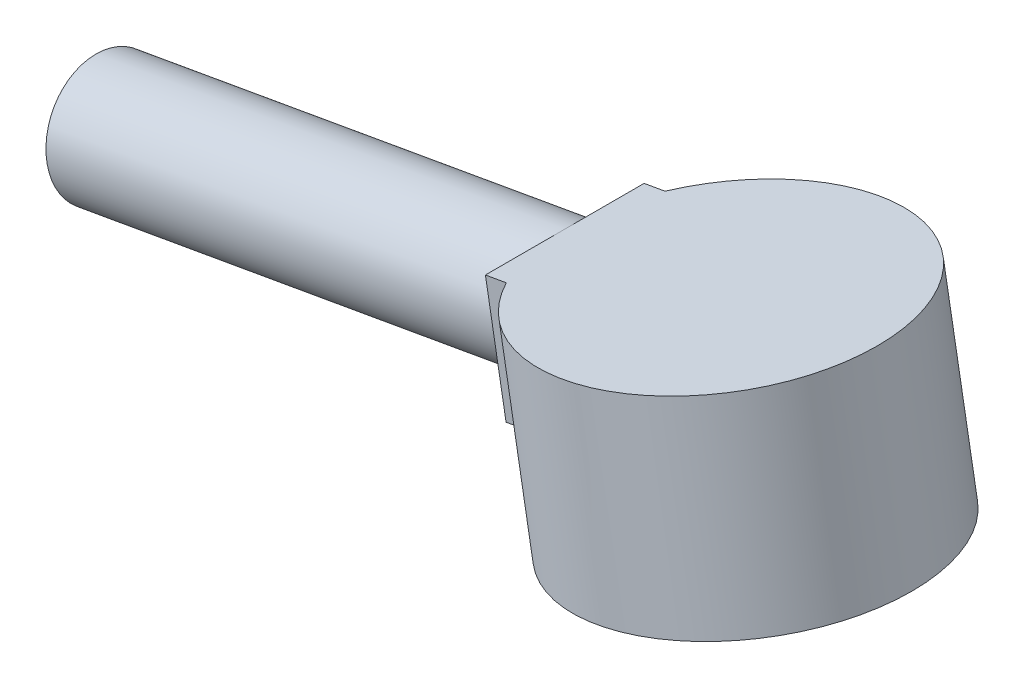
ISO-10303-21;
HEADER;
FILE_DESCRIPTION(('STEP AP214'),'2;1');
FILE_NAME('part.step','',(''),(''),'','','');
FILE_SCHEMA(('AUTOMOTIVE_DESIGN { 1 0 10303 214 1 1 1 1 }'));
ENDSEC;
DATA;
#1=APPLICATION_CONTEXT('core data for automotive mechanical design processes');
#2=APPLICATION_PROTOCOL_DEFINITION('international standard','automotive_design',2000,#1);
#3=PRODUCT_CONTEXT('',#1,'mechanical');
#4=PRODUCT('Part','Part','',(#3));
#5=PRODUCT_RELATED_PRODUCT_CATEGORY('part','',(#4));
#6=PRODUCT_DEFINITION_FORMATION('','',#4);
#7=PRODUCT_DEFINITION_CONTEXT('part definition',#1,'design');
#8=PRODUCT_DEFINITION('design','',#6,#7);
#9=PRODUCT_DEFINITION_SHAPE('','',#8);
#10=(LENGTH_UNIT() NAMED_UNIT(*) SI_UNIT(.MILLI.,.METRE.));
#11=(NAMED_UNIT(*) PLANE_ANGLE_UNIT() SI_UNIT($,.RADIAN.));
#12=(NAMED_UNIT(*) SI_UNIT($,.STERADIAN.) SOLID_ANGLE_UNIT());
#13=UNCERTAINTY_MEASURE_WITH_UNIT(LENGTH_MEASURE(1.E-05),#10,'distance_accuracy_value','');
#14=(GEOMETRIC_REPRESENTATION_CONTEXT(3) GLOBAL_UNCERTAINTY_ASSIGNED_CONTEXT((#13)) GLOBAL_UNIT_ASSIGNED_CONTEXT((#10,
#11,#12)) REPRESENTATION_CONTEXT('',''));
#15=CARTESIAN_POINT('',(0.,0.,0.));
#16=DIRECTION('',(0.,0.,1.));
#17=DIRECTION('',(1.,0.,0.));
#18=AXIS2_PLACEMENT_3D('',#15,#16,#17);
#19=CARTESIAN_POINT('',(576.813184603333,235.180258454421,1500.2586616298));
#20=DIRECTION('',(-0.173648177666917,0.98480775301221,0.));
#21=DIRECTION('',(0.984807753012211,0.173648177666917,0.));
#22=AXIS2_PLACEMENT_3D('',#19,#20,#21);
#23=PLANE('',#22);
#24=DIRECTION('',(-0.98480775301221,-0.173648177666917,0.));
#25=VECTOR('',#24,1.);
#26=CARTESIAN_POINT('',(576.813184603333,235.180258454421,1520.2586616298));
#27=LINE('',#26,#25);
#28=CARTESIAN_POINT('',(554.831775199223,231.304342902478,1520.2586616298));
#29=VERTEX_POINT('',#28);
#30=CARTESIAN_POINT('',(552.192990778028,230.839054012748,1520.2586616298));
#31=VERTEX_POINT('',#30);
#32=EDGE_CURVE('E119',#29,#31,#27,.T.);
#33=ORIENTED_EDGE('',*,*,#32,.T.);
#34=DIRECTION('',(0.,0.,1.));
#35=VECTOR('',#34,1.);
#36=CARTESIAN_POINT('',(552.192990778028,230.839054012748,1500.2586616298));
#37=LINE('',#36,#35);
#38=CARTESIAN_POINT('',(552.192990778028,230.839054012748,1510.2586616298));
#39=VERTEX_POINT('',#38);
#40=EDGE_CURVE('E108',#39,#31,#37,.T.);
#41=ORIENTED_EDGE('',*,*,#40,.F.);
#42=CARTESIAN_POINT('',(571.889145838272,234.312017566086,1510.2586616298));
#43=DIRECTION('',(0.173648177666917,-0.98480775301221,0.));
#44=DIRECTION('',(0.984807753012211,0.173648177666917,0.));
#45=AXIS2_PLACEMENT_3D('',#42,#43,#44);
#46=CIRCLE('',#45,20.0000000000001);
#47=EDGE_CURVE('E130',#29,#39,#46,.T.);
#48=ORIENTED_EDGE('',*,*,#47,.F.);
#49=EDGE_LOOP('',(#33,#41,#48));
#50=FACE_BOUND('',#49,.T.);
#51=ADVANCED_FACE('F39',(#50),#23,.F.);
#52=CARTESIAN_POINT('',(550.890629445526,238.225112160339,1510.2586616298));
#53=DIRECTION('',(-0.98480775301221,-0.173648177666917,0.));
#54=DIRECTION('',(-0.173648177666917,0.98480775301221,0.));
#55=AXIS2_PLACEMENT_3D('',#52,#53,#54);
#56=CYLINDRICAL_SURFACE('',#55,7.49999999999997);
#57=CARTESIAN_POINT('',(550.890629445526,238.225112160339,1510.2586616298));
#58=DIRECTION('',(0.984807753012211,0.173648177666917,0.));
#59=DIRECTION('',(-0.173648177666917,0.98480775301221,0.));
#60=AXIS2_PLACEMENT_3D('',#57,#58,#59);
#61=CIRCLE('',#60,7.49999999999997);
#62=CARTESIAN_POINT('',(549.588268113024,245.611170307931,1510.2586616298));
#63=VERTEX_POINT('',#62);
#64=EDGE_CURVE('E124',#63,#39,#61,.T.);
#65=ORIENTED_EDGE('',*,*,#64,.F.);
#66=EDGE_CURVE('E127',#39,#63,#61,.T.);
#67=ORIENTED_EDGE('',*,*,#66,.F.);
#68=EDGE_LOOP('',(#65,#67));
#69=FACE_BOUND('',#68,.T.);
#70=CARTESIAN_POINT('',(491.802164264793,227.806221500324,1510.2586616298));
#71=DIRECTION('',(0.984807753012211,0.173648177666917,0.));
#72=DIRECTION('',(-0.173648177666917,0.98480775301221,0.));
#73=AXIS2_PLACEMENT_3D('',#70,#71,#72);
#74=CIRCLE('',#73,7.49999999999997);
#75=CARTESIAN_POINT('',(490.499802932292,235.192279647916,1510.2586616298));
#76=VERTEX_POINT('',#75);
#77=EDGE_CURVE('E93',#76,#76,#74,.T.);
#78=ORIENTED_EDGE('',*,*,#77,.T.);
#79=EDGE_LOOP('',(#78));
#80=FACE_BOUND('',#79,.T.);
#81=ADVANCED_FACE('F139',(#69,#80),#56,.T.);
#82=CARTESIAN_POINT('',(491.802164264793,227.806221500324,1510.2586616298));
#83=DIRECTION('',(-0.984807753012211,-0.173648177666917,0.));
#84=DIRECTION('',(-0.173648177666917,0.98480775301221,0.));
#85=AXIS2_PLACEMENT_3D('',#82,#83,#84);
#86=PLANE('',#85);
#87=ORIENTED_EDGE('',*,*,#77,.F.);
#88=EDGE_LOOP('',(#87));
#89=FACE_BOUND('',#88,.T.);
#90=ADVANCED_FACE('F146',(#89),#86,.T.);
#91=CARTESIAN_POINT('',(575.018137900222,101.391212108543,0.));
#92=DIRECTION('',(-0.98480775301221,-0.173648177666919,0.));
#93=DIRECTION('',(-0.173648177666919,0.98480775301221,0.));
#94=AXIS2_PLACEMENT_3D('',#91,#92,#93);
#95=PLANE('',#94);
#96=ORIENTED_EDGE('',*,*,#64,.T.);
#97=ORIENTED_EDGE('',*,*,#40,.T.);
#98=DIRECTION('',(-0.173648177666919,0.98480775301221,0.));
#99=VECTOR('',#98,1.);
#100=CARTESIAN_POINT('',(552.192990778028,230.839054012748,1520.2586616298));
#101=LINE('',#100,#99);
#102=CARTESIAN_POINT('',(549.588268113024,245.611170307931,1520.2586616298));
#103=VERTEX_POINT('',#102);
#104=EDGE_CURVE('E89',#31,#103,#101,.T.);
#105=ORIENTED_EDGE('',*,*,#104,.T.);
#106=DIRECTION('',(0.,0.,-1.));
#107=VECTOR('',#106,1.);
#108=CARTESIAN_POINT('',(549.588268113024,245.611170307931,1500.2586616298));
#109=LINE('',#108,#107);
#110=EDGE_CURVE('E97',#103,#63,#109,.T.);
#111=ORIENTED_EDGE('',*,*,#110,.T.);
#112=EDGE_LOOP('',(#96,#97,#105,#111));
#113=FACE_BOUND('',#112,.T.);
#114=ADVANCED_FACE('F106',(#113),#95,.T.);
#115=ORIENTED_EDGE('',*,*,#66,.T.);
#116=CARTESIAN_POINT('',(549.588268113024,245.611170307931,1500.2586616298));
#117=VERTEX_POINT('',#116);
#118=EDGE_CURVE('E100',#63,#117,#109,.T.);
#119=ORIENTED_EDGE('',*,*,#118,.T.);
#120=DIRECTION('',(0.173648177666919,-0.98480775301221,0.));
#121=VECTOR('',#120,1.);
#122=CARTESIAN_POINT('',(552.192990778028,230.839054012748,1500.2586616298));
#123=LINE('',#122,#121);
#124=CARTESIAN_POINT('',(552.192990778028,230.839054012748,1500.2586616298));
#125=VERTEX_POINT('',#124);
#126=EDGE_CURVE('E104',#117,#125,#123,.T.);
#127=ORIENTED_EDGE('',*,*,#126,.T.);
#128=EDGE_CURVE('E116',#125,#39,#37,.T.);
#129=ORIENTED_EDGE('',*,*,#128,.T.);
#130=EDGE_LOOP('',(#115,#119,#127,#129));
#131=FACE_BOUND('',#130,.T.);
#132=ADVANCED_FACE('F167',(#131),#95,.T.);
#133=CARTESIAN_POINT('',(576.813184603333,235.180258454421,1520.2586616298));
#134=DIRECTION('',(0.,0.,-1.));
#135=DIRECTION('',(1.,0.,0.));
#136=AXIS2_PLACEMENT_3D('',#133,#134,#135);
#137=PLANE('',#136);
#138=DIRECTION('',(-0.98480775301221,-0.173648177666917,0.));
#139=VECTOR('',#138,1.);
#140=CARTESIAN_POINT('',(574.208461938329,249.952374749604,1520.2586616298));
#141=LINE('',#140,#139);
#142=CARTESIAN_POINT('',(552.22705253422,246.076459197661,1520.2586616298));
#143=VERTEX_POINT('',#142);
#144=EDGE_CURVE('E84',#143,#103,#141,.T.);
#145=ORIENTED_EDGE('',*,*,#144,.T.);
#146=ORIENTED_EDGE('',*,*,#104,.F.);
#147=ORIENTED_EDGE('',*,*,#32,.F.);
#148=DIRECTION('',(-0.173648177666917,0.98480775301221,0.));
#149=VECTOR('',#148,1.);
#150=CARTESIAN_POINT('',(556.568256975893,221.456265372356,1520.2586616298));
#151=LINE('',#150,#149);
#152=EDGE_CURVE('E91',#143,#29,#151,.F.);
#153=ORIENTED_EDGE('',*,*,#152,.F.);
#154=EDGE_LOOP('',(#145,#146,#147,#153));
#155=FACE_BOUND('',#154,.T.);
#156=ADVANCED_FACE('F86',(#155),#137,.F.);
#157=CARTESIAN_POINT('',(574.208461938329,249.952374749604,1500.2586616298));
#158=DIRECTION('',(0.173648177666917,-0.98480775301221,0.));
#159=DIRECTION('',(-0.984807753012211,-0.173648177666917,0.));
#160=AXIS2_PLACEMENT_3D('',#157,#158,#159);
#161=PLANE('',#160);
#162=CARTESIAN_POINT('',(569.284423173269,249.084133861269,1510.2586616298));
#163=DIRECTION('',(0.173648177666917,-0.984807753012211,0.));
#164=DIRECTION('',(0.98480775301221,0.173648177666917,0.));
#165=AXIS2_PLACEMENT_3D('',#162,#163,#164);
#166=CIRCLE('',#165,20.0000000000001);
#167=CARTESIAN_POINT('',(552.22705253422,246.076459197661,1500.2586616298));
#168=VERTEX_POINT('',#167);
#169=EDGE_CURVE('E54',#168,#143,#166,.T.);
#170=ORIENTED_EDGE('',*,*,#169,.F.);
#171=DIRECTION('',(-0.98480775301221,-0.173648177666917,0.));
#172=VECTOR('',#171,1.);
#173=CARTESIAN_POINT('',(574.208461938329,249.952374749604,1500.2586616298));
#174=LINE('',#173,#172);
#175=EDGE_CURVE('E94',#168,#117,#174,.T.);
#176=ORIENTED_EDGE('',*,*,#175,.T.);
#177=ORIENTED_EDGE('',*,*,#118,.F.);
#178=ORIENTED_EDGE('',*,*,#110,.F.);
#179=ORIENTED_EDGE('',*,*,#144,.F.);
#180=EDGE_LOOP('',(#170,#176,#177,#178,#179));
#181=FACE_BOUND('',#180,.T.);
#182=ADVANCED_FACE('F98',(#181),#161,.F.);
#183=CARTESIAN_POINT('',(576.813184603333,235.180258454421,1500.2586616298));
#184=DIRECTION('',(0.,0.,1.));
#185=DIRECTION('',(-1.,0.,0.));
#186=AXIS2_PLACEMENT_3D('',#183,#184,#185);
#187=PLANE('',#186);
#188=DIRECTION('',(-0.98480775301221,-0.173648177666917,0.));
#189=VECTOR('',#188,1.);
#190=CARTESIAN_POINT('',(576.813184603333,235.180258454421,1500.2586616298));
#191=LINE('',#190,#189);
#192=CARTESIAN_POINT('',(554.831775199223,231.304342902478,1500.2586616298));
#193=VERTEX_POINT('',#192);
#194=EDGE_CURVE('E121',#193,#125,#191,.T.);
#195=ORIENTED_EDGE('',*,*,#194,.T.);
#196=ORIENTED_EDGE('',*,*,#126,.F.);
#197=ORIENTED_EDGE('',*,*,#175,.F.);
#198=DIRECTION('',(-0.173648177666917,0.98480775301221,0.));
#199=VECTOR('',#198,1.);
#200=CARTESIAN_POINT('',(556.568256975893,221.456265372356,1500.2586616298));
#201=LINE('',#200,#199);
#202=EDGE_CURVE('E59',#193,#168,#201,.T.);
#203=ORIENTED_EDGE('',*,*,#202,.F.);
#204=EDGE_LOOP('',(#195,#196,#197,#203));
#205=FACE_BOUND('',#204,.T.);
#206=ADVANCED_FACE('F151',(#205),#187,.F.);
#207=ORIENTED_EDGE('',*,*,#128,.F.);
#208=ORIENTED_EDGE('',*,*,#194,.F.);
#209=EDGE_CURVE('E126',#39,#193,#46,.T.);
#210=ORIENTED_EDGE('',*,*,#209,.F.);
#211=EDGE_LOOP('',(#207,#208,#210));
#212=FACE_BOUND('',#211,.T.);
#213=ADVANCED_FACE('F141',(#212),#23,.F.);
#214=CARTESIAN_POINT('',(573.625627614942,224.463940035964,1510.2586616298));
#215=DIRECTION('',(-0.173648177666917,0.98480775301221,0.));
#216=DIRECTION('',(0.984807753012211,0.173648177666917,0.));
#217=AXIS2_PLACEMENT_3D('',#214,#215,#216);
#218=CYLINDRICAL_SURFACE('',#217,20.0000000000001);
#219=CARTESIAN_POINT('',(573.625627614942,224.463940035964,1510.2586616298));
#220=DIRECTION('',(0.173648177666917,-0.984807753012211,0.));
#221=DIRECTION('',(0.98480775301221,0.173648177666917,0.));
#222=AXIS2_PLACEMENT_3D('',#219,#220,#221);
#223=CIRCLE('',#222,20.0000000000001);
#224=CARTESIAN_POINT('',(593.321782675186,227.936903589302,1510.2586616298));
#225=VERTEX_POINT('',#224);
#226=EDGE_CURVE('E168',#225,#225,#223,.T.);
#227=ORIENTED_EDGE('',*,*,#226,.F.);
#228=EDGE_LOOP('',(#227));
#229=FACE_BOUND('',#228,.T.);
#230=ORIENTED_EDGE('',*,*,#152,.T.);
#231=ORIENTED_EDGE('',*,*,#47,.T.);
#232=ORIENTED_EDGE('',*,*,#209,.T.);
#233=ORIENTED_EDGE('',*,*,#202,.T.);
#234=ORIENTED_EDGE('',*,*,#169,.T.);
#235=EDGE_LOOP('',(#230,#231,#232,#233,#234));
#236=FACE_BOUND('',#235,.T.);
#237=ADVANCED_FACE('F136',(#229,#236),#218,.T.);
#238=CARTESIAN_POINT('',(573.625627614942,224.463940035964,1510.2586616298));
#239=DIRECTION('',(-0.173648177666917,0.984807753012211,0.));
#240=DIRECTION('',(0.98480775301221,0.173648177666917,0.));
#241=AXIS2_PLACEMENT_3D('',#238,#239,#240);
#242=PLANE('',#241);
#243=CARTESIAN_POINT('',(573.625627614942,224.463940035964,1510.2586616298));
#244=DIRECTION('',(0.173648177666917,-0.984807753012211,0.));
#245=DIRECTION('',(0.98480775301221,0.173648177666917,0.));
#246=AXIS2_PLACEMENT_3D('',#243,#244,#245);
#247=CIRCLE('',#246,14.797958971133);
#248=CARTESIAN_POINT('',(588.19877233847,227.033578644491,1510.2586616298));
#249=VERTEX_POINT('',#248);
#250=EDGE_CURVE('E11',#249,#249,#247,.T.);
#251=ORIENTED_EDGE('',*,*,#250,.F.);
#252=EDGE_LOOP('',(#251));
#253=FACE_BOUND('',#252,.T.);
#254=ORIENTED_EDGE('',*,*,#226,.T.);
#255=EDGE_LOOP('',(#254));
#256=FACE_BOUND('',#255,.T.);
#257=ADVANCED_FACE('F158',(#253,#256),#242,.F.);
#258=CARTESIAN_POINT('',(571.889145838273,234.312017566086,1510.2586616298));
#259=DIRECTION('',(-0.98480775301221,-0.173648177666917,0.));
#260=DIRECTION('',(0.,0.,-1.));
#261=AXIS2_PLACEMENT_3D('',#258,#259,#260);
#262=SPHERICAL_SURFACE('',#261,14.);
#263=CARTESIAN_POINT('',(571.889145838273,234.312017566086,1510.2586616298));
#264=DIRECTION('',(0.173648177666935,-0.984807753012207,0.));
#265=DIRECTION('',(0.984807753012207,0.173648177666935,0.));
#266=AXIS2_PLACEMENT_3D('',#263,#264,#265);
#267=SPHERICAL_SURFACE('',#266,14.);
#268=CARTESIAN_POINT('',(573.14035757847,227.216043171411,1510.2586616298));
#269=DIRECTION('',(0.173648177666935,-0.984807753012207,0.));
#270=DIRECTION('',(0.984807753012207,0.173648177666935,0.));
#271=AXIS2_PLACEMENT_3D('',#268,#269,#270);
#272=CIRCLE('',#271,12.0034002087454);
#273=CARTESIAN_POINT('',(584.961399166551,229.300411743467,1510.2586616298));
#274=VERTEX_POINT('',#273);
#275=EDGE_CURVE('E47',#274,#274,#272,.F.);
#276=ORIENTED_EDGE('',*,*,#275,.F.);
#277=EDGE_LOOP('',(#276));
#278=FACE_BOUND('',#277,.T.);
#279=ADVANCED_FACE('F175',(#278),#267,.F.);
#280=CARTESIAN_POINT('',(573.14035757847,227.216043171411,1510.2586616298));
#281=DIRECTION('',(0.173648177666935,-0.984807753012207,0.));
#282=DIRECTION('',(-0.984807753012207,-0.173648177666935,0.));
#283=AXIS2_PLACEMENT_3D('',#280,#281,#282);
#284=CONICAL_SURFACE('',#283,12.0034002087454,0.78539816339747);
#285=ORIENTED_EDGE('',*,*,#250,.T.);
#286=EDGE_LOOP('',(#285));
#287=FACE_BOUND('',#286,.T.);
#288=ORIENTED_EDGE('',*,*,#275,.T.);
#289=EDGE_LOOP('',(#288));
#290=FACE_BOUND('',#289,.T.);
#291=ADVANCED_FACE('F41',(#287,#290),#284,.F.);
#292=CLOSED_SHELL('',(#51,#81,#90,#114,#132,#156,#182,#206,#213,#237,#257,#279,#291));
#293=MANIFOLD_SOLID_BREP('B2',#292);
#294=ADVANCED_BREP_SHAPE_REPRESENTATION('',(#18,#293),#14);
#295=SHAPE_DEFINITION_REPRESENTATION(#9,#294);
ENDSEC;
END-ISO-10303-21;
